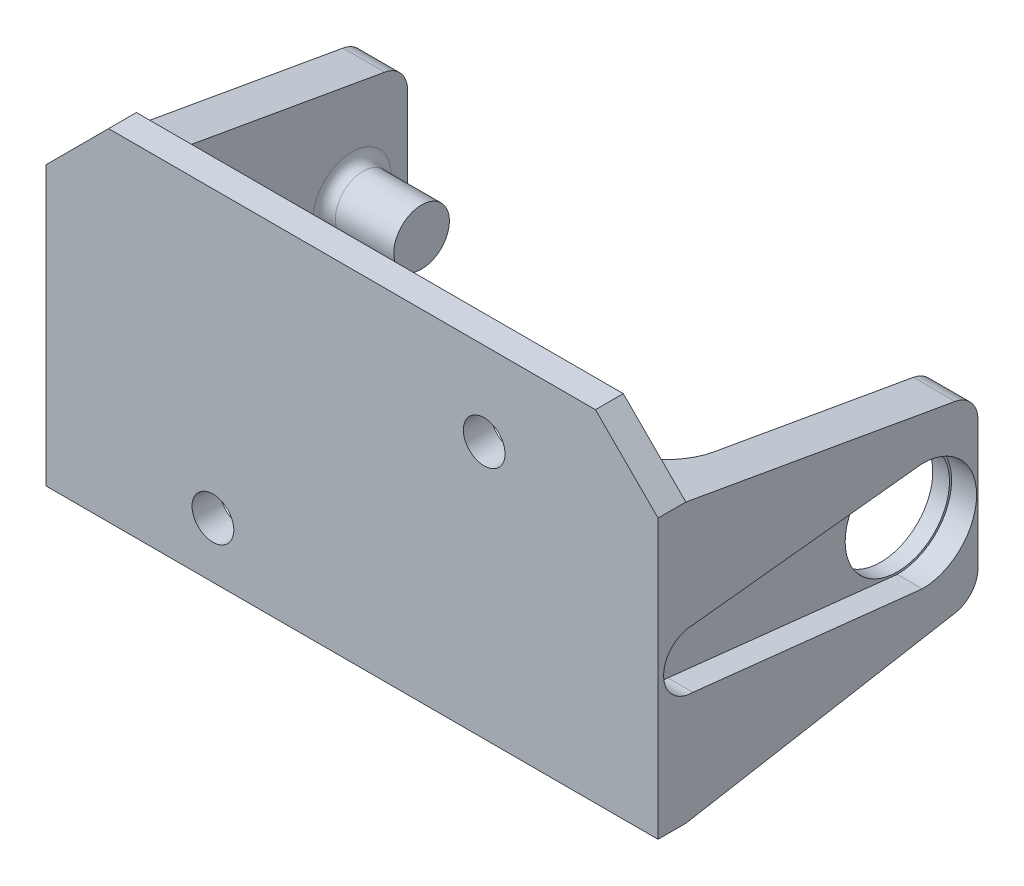
ISO-10303-21;
HEADER;
FILE_DESCRIPTION(('STEP AP214'),'2;1');
FILE_NAME('part.step','',(''),(''),'','','');
FILE_SCHEMA(('AUTOMOTIVE_DESIGN { 1 0 10303 214 1 1 1 1 }'));
ENDSEC;
DATA;
#1=APPLICATION_CONTEXT('core data for automotive mechanical design processes');
#2=APPLICATION_PROTOCOL_DEFINITION('international standard','automotive_design',2000,#1);
#3=PRODUCT_CONTEXT('',#1,'mechanical');
#4=PRODUCT('Part','Part','',(#3));
#5=PRODUCT_RELATED_PRODUCT_CATEGORY('part','',(#4));
#6=PRODUCT_DEFINITION_FORMATION('','',#4);
#7=PRODUCT_DEFINITION_CONTEXT('part definition',#1,'design');
#8=PRODUCT_DEFINITION('design','',#6,#7);
#9=PRODUCT_DEFINITION_SHAPE('','',#8);
#10=(LENGTH_UNIT() NAMED_UNIT(*) SI_UNIT(.MILLI.,.METRE.));
#11=(NAMED_UNIT(*) PLANE_ANGLE_UNIT() SI_UNIT($,.RADIAN.));
#12=(NAMED_UNIT(*) SI_UNIT($,.STERADIAN.) SOLID_ANGLE_UNIT());
#13=UNCERTAINTY_MEASURE_WITH_UNIT(LENGTH_MEASURE(1.E-05),#10,'distance_accuracy_value','');
#14=(GEOMETRIC_REPRESENTATION_CONTEXT(3) GLOBAL_UNCERTAINTY_ASSIGNED_CONTEXT((#13)) GLOBAL_UNIT_ASSIGNED_CONTEXT((#10,
#11,#12)) REPRESENTATION_CONTEXT('',''));
#15=CARTESIAN_POINT('',(0.,0.,0.));
#16=DIRECTION('',(0.,0.,1.));
#17=DIRECTION('',(1.,0.,0.));
#18=AXIS2_PLACEMENT_3D('',#15,#16,#17);
#19=CARTESIAN_POINT('',(0.,0.,2.));
#20=DIRECTION('',(0.,0.,-1.));
#21=DIRECTION('',(-1.,0.,0.));
#22=AXIS2_PLACEMENT_3D('',#19,#20,#21);
#23=PLANE('',#22);
#24=CARTESIAN_POINT('',(9.50000000000001,8.49999999999995,2.));
#25=DIRECTION('',(0.,0.,-1.));
#26=DIRECTION('',(-1.,0.,0.));
#27=AXIS2_PLACEMENT_3D('',#24,#25,#26);
#28=CIRCLE('',#27,1.5);
#29=CARTESIAN_POINT('',(8.00000000000001,8.49999999999995,2.));
#30=VERTEX_POINT('',#29);
#31=EDGE_CURVE('E547',#30,#30,#28,.T.);
#32=ORIENTED_EDGE('',*,*,#31,.T.);
#33=EDGE_LOOP('',(#32));
#34=FACE_BOUND('',#33,.T.);
#35=CARTESIAN_POINT('',(-10.,-6.,2.));
#36=DIRECTION('',(0.,0.,-1.));
#37=DIRECTION('',(-1.,0.,0.));
#38=AXIS2_PLACEMENT_3D('',#35,#36,#37);
#39=CIRCLE('',#38,1.5);
#40=CARTESIAN_POINT('',(-11.5,-6.,2.));
#41=VERTEX_POINT('',#40);
#42=EDGE_CURVE('E548',#41,#41,#39,.T.);
#43=ORIENTED_EDGE('',*,*,#42,.T.);
#44=EDGE_LOOP('',(#43));
#45=FACE_BOUND('',#44,.T.);
#46=DIRECTION('',(0.,-1.,0.));
#47=VECTOR('',#46,1.);
#48=CARTESIAN_POINT('',(-22.,-10.,2.));
#49=LINE('',#48,#47);
#50=CARTESIAN_POINT('',(-22.,10.,2.));
#51=VERTEX_POINT('',#50);
#52=CARTESIAN_POINT('',(-22.,-10.,2.));
#53=VERTEX_POINT('',#52);
#54=EDGE_CURVE('E228',#51,#53,#49,.T.);
#55=ORIENTED_EDGE('',*,*,#54,.T.);
#56=DIRECTION('',(1.,0.,0.));
#57=VECTOR('',#56,1.);
#58=CARTESIAN_POINT('',(0.,-10.,2.));
#59=LINE('',#58,#57);
#60=CARTESIAN_POINT('',(22.,-10.,2.));
#61=VERTEX_POINT('',#60);
#62=EDGE_CURVE('E213',#53,#61,#59,.T.);
#63=ORIENTED_EDGE('',*,*,#62,.T.);
#64=DIRECTION('',(0.,-1.,0.));
#65=VECTOR('',#64,1.);
#66=CARTESIAN_POINT('',(22.,-10.,2.));
#67=LINE('',#66,#65);
#68=CARTESIAN_POINT('',(22.,10.,2.));
#69=VERTEX_POINT('',#68);
#70=EDGE_CURVE('E221',#69,#61,#67,.T.);
#71=ORIENTED_EDGE('',*,*,#70,.F.);
#72=DIRECTION('',(0.707106781186551,-0.707106781186544,0.));
#73=VECTOR('',#72,1.);
#74=CARTESIAN_POINT('',(17.5,14.5,2.));
#75=LINE('',#74,#73);
#76=CARTESIAN_POINT('',(17.5,14.5,2.));
#77=VERTEX_POINT('',#76);
#78=EDGE_CURVE('E327',#77,#69,#75,.T.);
#79=ORIENTED_EDGE('',*,*,#78,.F.);
#80=DIRECTION('',(1.,0.,0.));
#81=VECTOR('',#80,1.);
#82=CARTESIAN_POINT('',(-17.5,14.5,2.));
#83=LINE('',#82,#81);
#84=CARTESIAN_POINT('',(-17.5,14.5,2.));
#85=VERTEX_POINT('',#84);
#86=EDGE_CURVE('E321',#85,#77,#83,.T.);
#87=ORIENTED_EDGE('',*,*,#86,.F.);
#88=DIRECTION('',(0.707106781186551,0.707106781186544,0.));
#89=VECTOR('',#88,1.);
#90=CARTESIAN_POINT('',(-22.,10.,2.));
#91=LINE('',#90,#89);
#92=EDGE_CURVE('E336',#51,#85,#91,.T.);
#93=ORIENTED_EDGE('',*,*,#92,.F.);
#94=EDGE_LOOP('',(#55,#63,#71,#79,#87,#93));
#95=FACE_BOUND('',#94,.T.);
#96=ADVANCED_FACE('F68',(#34,#45,#95),#23,.F.);
#97=CARTESIAN_POINT('',(0.,0.,0.));
#98=DIRECTION('',(0.,0.,-1.));
#99=DIRECTION('',(-1.,0.,0.));
#100=AXIS2_PLACEMENT_3D('',#97,#98,#99);
#101=PLANE('',#100);
#102=CARTESIAN_POINT('',(9.50000000000001,8.49999999999995,0.));
#103=DIRECTION('',(0.,0.,-1.));
#104=DIRECTION('',(-1.,0.,0.));
#105=AXIS2_PLACEMENT_3D('',#102,#103,#104);
#106=CIRCLE('',#105,1.5);
#107=CARTESIAN_POINT('',(8.00000000000001,8.49999999999995,0.));
#108=VERTEX_POINT('',#107);
#109=EDGE_CURVE('E545',#108,#108,#106,.T.);
#110=ORIENTED_EDGE('',*,*,#109,.F.);
#111=EDGE_LOOP('',(#110));
#112=FACE_BOUND('',#111,.T.);
#113=CARTESIAN_POINT('',(-10.,-6.,0.));
#114=DIRECTION('',(0.,0.,-1.));
#115=DIRECTION('',(-1.,0.,0.));
#116=AXIS2_PLACEMENT_3D('',#113,#114,#115);
#117=CIRCLE('',#116,1.5);
#118=CARTESIAN_POINT('',(-11.5,-6.,0.));
#119=VERTEX_POINT('',#118);
#120=EDGE_CURVE('E554',#119,#119,#117,.T.);
#121=ORIENTED_EDGE('',*,*,#120,.F.);
#122=EDGE_LOOP('',(#121));
#123=FACE_BOUND('',#122,.T.);
#124=DIRECTION('',(1.,0.,0.));
#125=VECTOR('',#124,1.);
#126=CARTESIAN_POINT('',(0.,-10.,0.));
#127=LINE('',#126,#125);
#128=CARTESIAN_POINT('',(-14.,-10.,0.));
#129=VERTEX_POINT('',#128);
#130=CARTESIAN_POINT('',(14.,-10.,0.));
#131=VERTEX_POINT('',#130);
#132=EDGE_CURVE('E231',#129,#131,#127,.T.);
#133=ORIENTED_EDGE('',*,*,#132,.F.);
#134=DIRECTION('',(0.,-1.,0.));
#135=VECTOR('',#134,1.);
#136=CARTESIAN_POINT('',(-14.,10.,0.));
#137=LINE('',#136,#135);
#138=CARTESIAN_POINT('',(-14.,10.,0.));
#139=VERTEX_POINT('',#138);
#140=EDGE_CURVE('E564',#129,#139,#137,.F.);
#141=ORIENTED_EDGE('',*,*,#140,.T.);
#142=DIRECTION('',(1.,0.,0.));
#143=VECTOR('',#142,1.);
#144=CARTESIAN_POINT('',(-22.,10.,0.));
#145=LINE('',#144,#143);
#146=CARTESIAN_POINT('',(-22.,10.,0.));
#147=VERTEX_POINT('',#146);
#148=EDGE_CURVE('E377',#147,#139,#145,.T.);
#149=ORIENTED_EDGE('',*,*,#148,.F.);
#150=DIRECTION('',(0.707106781186551,0.707106781186544,0.));
#151=VECTOR('',#150,1.);
#152=CARTESIAN_POINT('',(-22.,10.,0.));
#153=LINE('',#152,#151);
#154=CARTESIAN_POINT('',(-17.5,14.5,0.));
#155=VERTEX_POINT('',#154);
#156=EDGE_CURVE('E326',#147,#155,#153,.T.);
#157=ORIENTED_EDGE('',*,*,#156,.T.);
#158=DIRECTION('',(1.,0.,0.));
#159=VECTOR('',#158,1.);
#160=CARTESIAN_POINT('',(-17.5,14.5,0.));
#161=LINE('',#160,#159);
#162=CARTESIAN_POINT('',(17.5,14.5,0.));
#163=VERTEX_POINT('',#162);
#164=EDGE_CURVE('E323',#155,#163,#161,.T.);
#165=ORIENTED_EDGE('',*,*,#164,.T.);
#166=DIRECTION('',(0.707106781186551,-0.707106781186544,0.));
#167=VECTOR('',#166,1.);
#168=CARTESIAN_POINT('',(17.5,14.5,0.));
#169=LINE('',#168,#167);
#170=CARTESIAN_POINT('',(22.,10.,0.));
#171=VERTEX_POINT('',#170);
#172=EDGE_CURVE('E330',#163,#171,#169,.T.);
#173=ORIENTED_EDGE('',*,*,#172,.T.);
#174=DIRECTION('',(-1.,0.,0.));
#175=VECTOR('',#174,1.);
#176=CARTESIAN_POINT('',(22.,10.,0.));
#177=LINE('',#176,#175);
#178=CARTESIAN_POINT('',(14.,10.,0.));
#179=VERTEX_POINT('',#178);
#180=EDGE_CURVE('E255',#171,#179,#177,.T.);
#181=ORIENTED_EDGE('',*,*,#180,.T.);
#182=DIRECTION('',(0.,1.,0.));
#183=VECTOR('',#182,1.);
#184=CARTESIAN_POINT('',(14.,-10.,0.));
#185=LINE('',#184,#183);
#186=EDGE_CURVE('E287',#179,#131,#185,.F.);
#187=ORIENTED_EDGE('',*,*,#186,.T.);
#188=EDGE_LOOP('',(#133,#141,#149,#157,#165,#173,#181,#187));
#189=FACE_BOUND('',#188,.T.);
#190=ADVANCED_FACE('F433',(#112,#123,#189),#101,.T.);
#191=CARTESIAN_POINT('',(22.,-6.58854964879215,-19.3472963553338));
#192=DIRECTION('',(0.,0.984807753012208,0.173648177666927));
#193=DIRECTION('',(0.,-0.173648177666927,0.984807753012209));
#194=AXIS2_PLACEMENT_3D('',#191,#192,#193);
#195=PLANE('',#194);
#196=DIRECTION('',(-1.,0.,0.));
#197=VECTOR('',#196,1.);
#198=CARTESIAN_POINT('',(22.,-10.,0.));
#199=LINE('',#198,#197);
#200=CARTESIAN_POINT('',(22.,-10.,0.));
#201=VERTEX_POINT('',#200);
#202=EDGE_CURVE('E216',#201,#131,#199,.T.);
#203=ORIENTED_EDGE('',*,*,#202,.T.);
#204=CARTESIAN_POINT('',(14.,-9.11836509645769,-5.));
#205=DIRECTION('',(0.,0.984807753012208,0.173648177666927));
#206=DIRECTION('',(0.,-0.173648177666927,0.984807753012209));
#207=AXIS2_PLACEMENT_3D('',#204,#205,#206);
#208=ELLIPSE('',#207,5.07713305942872,5.);
#209=CARTESIAN_POINT('',(19.,-9.11836509645769,-5.));
#210=VERTEX_POINT('',#209);
#211=EDGE_CURVE('E12',#131,#210,#208,.T.);
#212=ORIENTED_EDGE('',*,*,#211,.T.);
#213=DIRECTION('',(0.,0.173648177666927,-0.984807753012209));
#214=VECTOR('',#213,1.);
#215=CARTESIAN_POINT('',(19.,-6.58854964879215,-19.3472963553338));
#216=LINE('',#215,#214);
#217=CARTESIAN_POINT('',(19.,-6.58854964879215,-19.3472963553338));
#218=VERTEX_POINT('',#217);
#219=EDGE_CURVE('E259',#210,#218,#216,.T.);
#220=ORIENTED_EDGE('',*,*,#219,.T.);
#221=DIRECTION('',(-1.,0.,0.));
#222=VECTOR('',#221,1.);
#223=CARTESIAN_POINT('',(22.,-6.58854964879215,-19.3472963553338));
#224=LINE('',#223,#222);
#225=CARTESIAN_POINT('',(22.,-6.58854964879215,-19.3472963553338));
#226=VERTEX_POINT('',#225);
#227=EDGE_CURVE('E271',#226,#218,#224,.T.);
#228=ORIENTED_EDGE('',*,*,#227,.F.);
#229=DIRECTION('',(0.,0.173648177666927,-0.984807753012209));
#230=VECTOR('',#229,1.);
#231=CARTESIAN_POINT('',(22.,-6.58854964879215,-19.3472963553338));
#232=LINE('',#231,#230);
#233=EDGE_CURVE('E220',#201,#226,#232,.T.);
#234=ORIENTED_EDGE('',*,*,#233,.F.);
#235=EDGE_LOOP('',(#203,#212,#220,#228,#234));
#236=FACE_BOUND('',#235,.T.);
#237=ADVANCED_FACE('F439',(#236),#195,.F.);
#238=CARTESIAN_POINT('',(22.,-4.61893414276774,-19.));
#239=DIRECTION('',(-1.,0.,0.));
#240=DIRECTION('',(0.,0.,1.));
#241=AXIS2_PLACEMENT_3D('',#238,#239,#240);
#242=CYLINDRICAL_SURFACE('',#241,2.);
#243=CARTESIAN_POINT('',(19.,-4.61893414276774,-19.));
#244=DIRECTION('',(1.,0.,0.));
#245=DIRECTION('',(0.,0.,1.));
#246=AXIS2_PLACEMENT_3D('',#243,#244,#245);
#247=CIRCLE('',#246,2.);
#248=CARTESIAN_POINT('',(19.,-4.61893414276774,-21.));
#249=VERTEX_POINT('',#248);
#250=EDGE_CURVE('E256',#218,#249,#247,.T.);
#251=ORIENTED_EDGE('',*,*,#250,.T.);
#252=DIRECTION('',(-1.,0.,0.));
#253=VECTOR('',#252,1.);
#254=CARTESIAN_POINT('',(22.,-4.61893414276774,-21.));
#255=LINE('',#254,#253);
#256=CARTESIAN_POINT('',(22.,-4.61893414276774,-21.));
#257=VERTEX_POINT('',#256);
#258=EDGE_CURVE('E268',#257,#249,#255,.T.);
#259=ORIENTED_EDGE('',*,*,#258,.F.);
#260=CARTESIAN_POINT('',(22.,-4.61893414276774,-19.));
#261=DIRECTION('',(1.,0.,0.));
#262=DIRECTION('',(0.,0.,1.));
#263=AXIS2_PLACEMENT_3D('',#260,#261,#262);
#264=CIRCLE('',#263,2.);
#265=EDGE_CURVE('E246',#226,#257,#264,.T.);
#266=ORIENTED_EDGE('',*,*,#265,.F.);
#267=ORIENTED_EDGE('',*,*,#227,.T.);
#268=EDGE_LOOP('',(#251,#259,#266,#267));
#269=FACE_BOUND('',#268,.T.);
#270=ADVANCED_FACE('F446',(#269),#242,.T.);
#271=CARTESIAN_POINT('',(22.,4.61893414276776,-21.));
#272=DIRECTION('',(0.,0.,1.));
#273=DIRECTION('',(0.,-1.,0.));
#274=AXIS2_PLACEMENT_3D('',#271,#272,#273);
#275=PLANE('',#274);
#276=DIRECTION('',(0.,1.,0.));
#277=VECTOR('',#276,1.);
#278=CARTESIAN_POINT('',(19.,4.61893414276776,-21.));
#279=LINE('',#278,#277);
#280=CARTESIAN_POINT('',(19.,4.61893414276776,-21.));
#281=VERTEX_POINT('',#280);
#282=EDGE_CURVE('E258',#249,#281,#279,.T.);
#283=ORIENTED_EDGE('',*,*,#282,.T.);
#284=DIRECTION('',(-1.,0.,0.));
#285=VECTOR('',#284,1.);
#286=CARTESIAN_POINT('',(22.,4.61893414276776,-21.));
#287=LINE('',#286,#285);
#288=CARTESIAN_POINT('',(22.,4.61893414276776,-21.));
#289=VERTEX_POINT('',#288);
#290=EDGE_CURVE('E265',#289,#281,#287,.T.);
#291=ORIENTED_EDGE('',*,*,#290,.F.);
#292=DIRECTION('',(0.,1.,0.));
#293=VECTOR('',#292,1.);
#294=CARTESIAN_POINT('',(22.,4.61893414276776,-21.));
#295=LINE('',#294,#293);
#296=EDGE_CURVE('E248',#257,#289,#295,.T.);
#297=ORIENTED_EDGE('',*,*,#296,.F.);
#298=ORIENTED_EDGE('',*,*,#258,.T.);
#299=EDGE_LOOP('',(#283,#291,#297,#298));
#300=FACE_BOUND('',#299,.T.);
#301=ADVANCED_FACE('F450',(#300),#275,.F.);
#302=CARTESIAN_POINT('',(22.,4.61893414276776,-19.));
#303=DIRECTION('',(-1.,0.,0.));
#304=DIRECTION('',(0.,0.,1.));
#305=AXIS2_PLACEMENT_3D('',#302,#303,#304);
#306=CYLINDRICAL_SURFACE('',#305,2.);
#307=CARTESIAN_POINT('',(19.,4.61893414276776,-19.));
#308=DIRECTION('',(1.,0.,0.));
#309=DIRECTION('',(0.,0.,1.));
#310=AXIS2_PLACEMENT_3D('',#307,#308,#309);
#311=CIRCLE('',#310,2.);
#312=CARTESIAN_POINT('',(19.,6.58854964879218,-19.3472963553338));
#313=VERTEX_POINT('',#312);
#314=EDGE_CURVE('E239',#281,#313,#311,.T.);
#315=ORIENTED_EDGE('',*,*,#314,.T.);
#316=DIRECTION('',(-1.,0.,0.));
#317=VECTOR('',#316,1.);
#318=CARTESIAN_POINT('',(22.,6.58854964879218,-19.3472963553338));
#319=LINE('',#318,#317);
#320=CARTESIAN_POINT('',(22.,6.58854964879218,-19.3472963553338));
#321=VERTEX_POINT('',#320);
#322=EDGE_CURVE('E262',#321,#313,#319,.T.);
#323=ORIENTED_EDGE('',*,*,#322,.F.);
#324=CARTESIAN_POINT('',(22.,4.61893414276776,-19.));
#325=DIRECTION('',(1.,0.,0.));
#326=DIRECTION('',(0.,0.,1.));
#327=AXIS2_PLACEMENT_3D('',#324,#325,#326);
#328=CIRCLE('',#327,2.);
#329=EDGE_CURVE('E250',#289,#321,#328,.T.);
#330=ORIENTED_EDGE('',*,*,#329,.F.);
#331=ORIENTED_EDGE('',*,*,#290,.T.);
#332=EDGE_LOOP('',(#315,#323,#330,#331));
#333=FACE_BOUND('',#332,.T.);
#334=ADVANCED_FACE('F454',(#333),#306,.T.);
#335=CARTESIAN_POINT('',(22.,10.,0.));
#336=DIRECTION('',(0.,-0.984807753012209,0.173648177666926));
#337=DIRECTION('',(0.,-0.173648177666926,-0.984807753012209));
#338=AXIS2_PLACEMENT_3D('',#335,#336,#337);
#339=PLANE('',#338);
#340=DIRECTION('',(0.,0.173648177666926,0.984807753012209));
#341=VECTOR('',#340,1.);
#342=CARTESIAN_POINT('',(19.,10.,0.));
#343=LINE('',#342,#341);
#344=CARTESIAN_POINT('',(19.,9.1183650964577,-5.));
#345=VERTEX_POINT('',#344);
#346=EDGE_CURVE('E236',#313,#345,#343,.T.);
#347=ORIENTED_EDGE('',*,*,#346,.T.);
#348=CARTESIAN_POINT('',(14.,9.1183650964577,-5.));
#349=DIRECTION('',(0.,-0.984807753012209,0.173648177666926));
#350=DIRECTION('',(0.,-0.173648177666926,-0.984807753012209));
#351=AXIS2_PLACEMENT_3D('',#348,#349,#350);
#352=ELLIPSE('',#351,5.07713305942872,5.);
#353=EDGE_CURVE('E77',#345,#179,#352,.T.);
#354=ORIENTED_EDGE('',*,*,#353,.T.);
#355=ORIENTED_EDGE('',*,*,#180,.F.);
#356=DIRECTION('',(0.,0.173648177666926,0.984807753012209));
#357=VECTOR('',#356,1.);
#358=CARTESIAN_POINT('',(22.,10.,0.));
#359=LINE('',#358,#357);
#360=EDGE_CURVE('E252',#321,#171,#359,.T.);
#361=ORIENTED_EDGE('',*,*,#360,.F.);
#362=ORIENTED_EDGE('',*,*,#322,.T.);
#363=EDGE_LOOP('',(#347,#354,#355,#361,#362));
#364=FACE_BOUND('',#363,.T.);
#365=ADVANCED_FACE('F458',(#364),#339,.F.);
#366=CARTESIAN_POINT('',(22.,4.61893414276776,-19.));
#367=DIRECTION('',(-1.,0.,0.));
#368=DIRECTION('',(0.,0.,1.));
#369=AXIS2_PLACEMENT_3D('',#366,#367,#368);
#370=PLANE('',#369);
#371=CARTESIAN_POINT('',(22.,0.,-0.499999999999997));
#372=DIRECTION('',(-1.,0.,0.));
#373=DIRECTION('',(0.,0.,1.));
#374=AXIS2_PLACEMENT_3D('',#371,#372,#373);
#375=CIRCLE('',#374,2.1);
#376=CARTESIAN_POINT('',(22.,-2.1,-0.499999999999997));
#377=VERTEX_POINT('',#376);
#378=CARTESIAN_POINT('',(22.,2.1,-0.499999999999997));
#379=VERTEX_POINT('',#378);
#380=EDGE_CURVE('E394',#377,#379,#375,.T.);
#381=ORIENTED_EDGE('',*,*,#380,.T.);
#382=DIRECTION('',(0.,0.108447510175418,-0.994102176607995));
#383=VECTOR('',#382,1.);
#384=CARTESIAN_POINT('',(22.,4.12407109739942,-19.0539850594947));
#385=LINE('',#384,#383);
#386=CARTESIAN_POINT('',(22.,3.9,-17.));
#387=VERTEX_POINT('',#386);
#388=EDGE_CURVE('E403',#379,#387,#385,.T.);
#389=ORIENTED_EDGE('',*,*,#388,.T.);
#390=CARTESIAN_POINT('',(22.,0.,-17.));
#391=DIRECTION('',(-1.,0.,0.));
#392=DIRECTION('',(0.,0.,1.));
#393=AXIS2_PLACEMENT_3D('',#390,#391,#392);
#394=CIRCLE('',#393,3.9);
#395=CARTESIAN_POINT('',(22.,-3.9,-17.));
#396=VERTEX_POINT('',#395);
#397=EDGE_CURVE('E400',#387,#396,#394,.T.);
#398=ORIENTED_EDGE('',*,*,#397,.T.);
#399=DIRECTION('',(0.,0.108447510175418,0.994102176607995));
#400=VECTOR('',#399,1.);
#401=CARTESIAN_POINT('',(22.,-4.01542579903965,-18.0580698245301));
#402=LINE('',#401,#400);
#403=EDGE_CURVE('E397',#396,#377,#402,.T.);
#404=ORIENTED_EDGE('',*,*,#403,.T.);
#405=EDGE_LOOP('',(#381,#389,#398,#404));
#406=FACE_BOUND('',#405,.T.);
#407=ORIENTED_EDGE('',*,*,#70,.T.);
#408=DIRECTION('',(0.,0.,-1.));
#409=VECTOR('',#408,1.);
#410=CARTESIAN_POINT('',(22.,-10.,0.));
#411=LINE('',#410,#409);
#412=EDGE_CURVE('E210',#61,#201,#411,.T.);
#413=ORIENTED_EDGE('',*,*,#412,.T.);
#414=ORIENTED_EDGE('',*,*,#233,.T.);
#415=ORIENTED_EDGE('',*,*,#265,.T.);
#416=ORIENTED_EDGE('',*,*,#296,.T.);
#417=ORIENTED_EDGE('',*,*,#329,.T.);
#418=ORIENTED_EDGE('',*,*,#360,.T.);
#419=DIRECTION('',(0.,0.,1.));
#420=VECTOR('',#419,1.);
#421=CARTESIAN_POINT('',(22.,10.,2.));
#422=LINE('',#421,#420);
#423=EDGE_CURVE('E235',#171,#69,#422,.T.);
#424=ORIENTED_EDGE('',*,*,#423,.T.);
#425=EDGE_LOOP('',(#407,#413,#414,#415,#416,#417,#418,#424));
#426=FACE_BOUND('',#425,.T.);
#427=ADVANCED_FACE('F233',(#406,#426),#370,.F.);
#428=CARTESIAN_POINT('',(19.,4.61893414276776,-19.));
#429=DIRECTION('',(-1.,0.,0.));
#430=DIRECTION('',(0.,0.,1.));
#431=AXIS2_PLACEMENT_3D('',#428,#429,#430);
#432=PLANE('',#431);
#433=CARTESIAN_POINT('',(19.,0.,-17.));
#434=DIRECTION('',(-1.,0.,0.));
#435=DIRECTION('',(0.,0.,1.));
#436=AXIS2_PLACEMENT_3D('',#433,#434,#435);
#437=CIRCLE('',#436,3.75);
#438=CARTESIAN_POINT('',(19.,0.,-13.25));
#439=VERTEX_POINT('',#438);
#440=EDGE_CURVE('E230',#439,#439,#437,.T.);
#441=ORIENTED_EDGE('',*,*,#440,.F.);
#442=EDGE_LOOP('',(#441));
#443=FACE_BOUND('',#442,.T.);
#444=ORIENTED_EDGE('',*,*,#219,.F.);
#445=DIRECTION('',(0.,1.,0.));
#446=VECTOR('',#445,1.);
#447=CARTESIAN_POINT('',(19.,10.,-5.));
#448=LINE('',#447,#446);
#449=EDGE_CURVE('E573',#210,#345,#448,.T.);
#450=ORIENTED_EDGE('',*,*,#449,.T.);
#451=ORIENTED_EDGE('',*,*,#346,.F.);
#452=ORIENTED_EDGE('',*,*,#314,.F.);
#453=ORIENTED_EDGE('',*,*,#282,.F.);
#454=ORIENTED_EDGE('',*,*,#250,.F.);
#455=EDGE_LOOP('',(#444,#450,#451,#452,#453,#454));
#456=FACE_BOUND('',#455,.T.);
#457=ADVANCED_FACE('F463',(#443,#456),#432,.T.);
#458=CARTESIAN_POINT('',(-22.,10.,0.));
#459=DIRECTION('',(0.,0.984807753012209,-0.173648177666926));
#460=DIRECTION('',(0.,0.173648177666926,0.984807753012209));
#461=AXIS2_PLACEMENT_3D('',#458,#459,#460);
#462=PLANE('',#461);
#463=DIRECTION('',(0.,0.173648177666926,0.984807753012209));
#464=VECTOR('',#463,1.);
#465=CARTESIAN_POINT('',(-19.,10.,0.));
#466=LINE('',#465,#464);
#467=CARTESIAN_POINT('',(-19.,6.58854964879218,-19.3472963553338));
#468=VERTEX_POINT('',#467);
#469=CARTESIAN_POINT('',(-19.,9.1183650964577,-5.));
#470=VERTEX_POINT('',#469);
#471=EDGE_CURVE('E333',#468,#470,#466,.T.);
#472=ORIENTED_EDGE('',*,*,#471,.F.);
#473=DIRECTION('',(1.,0.,0.));
#474=VECTOR('',#473,1.);
#475=CARTESIAN_POINT('',(-22.,6.58854964879218,-19.3472963553338));
#476=LINE('',#475,#474);
#477=CARTESIAN_POINT('',(-22.,6.58854964879218,-19.3472963553338));
#478=VERTEX_POINT('',#477);
#479=EDGE_CURVE('E242',#478,#468,#476,.T.);
#480=ORIENTED_EDGE('',*,*,#479,.F.);
#481=DIRECTION('',(0.,0.173648177666926,0.984807753012209));
#482=VECTOR('',#481,1.);
#483=CARTESIAN_POINT('',(-22.,10.,0.));
#484=LINE('',#483,#482);
#485=EDGE_CURVE('E344',#478,#147,#484,.T.);
#486=ORIENTED_EDGE('',*,*,#485,.T.);
#487=ORIENTED_EDGE('',*,*,#148,.T.);
#488=CARTESIAN_POINT('',(-14.,9.1183650964577,-5.));
#489=DIRECTION('',(0.,0.984807753012209,-0.173648177666926));
#490=DIRECTION('',(0.,0.173648177666926,0.984807753012209));
#491=AXIS2_PLACEMENT_3D('',#488,#489,#490);
#492=ELLIPSE('',#491,5.07713305942872,5.);
#493=EDGE_CURVE('E572',#139,#470,#492,.F.);
#494=ORIENTED_EDGE('',*,*,#493,.T.);
#495=EDGE_LOOP('',(#472,#480,#486,#487,#494));
#496=FACE_BOUND('',#495,.T.);
#497=ADVANCED_FACE('F466',(#496),#462,.T.);
#498=CARTESIAN_POINT('',(-22.,4.61893414276776,-19.));
#499=DIRECTION('',(1.,0.,0.));
#500=DIRECTION('',(0.,0.,-1.));
#501=AXIS2_PLACEMENT_3D('',#498,#499,#500);
#502=CYLINDRICAL_SURFACE('',#501,2.);
#503=CARTESIAN_POINT('',(-19.,4.61893414276776,-19.));
#504=DIRECTION('',(1.,0.,0.));
#505=DIRECTION('',(0.,0.,1.));
#506=AXIS2_PLACEMENT_3D('',#503,#504,#505);
#507=CIRCLE('',#506,2.);
#508=CARTESIAN_POINT('',(-19.,4.61893414276776,-21.));
#509=VERTEX_POINT('',#508);
#510=EDGE_CURVE('E361',#509,#468,#507,.T.);
#511=ORIENTED_EDGE('',*,*,#510,.F.);
#512=DIRECTION('',(1.,0.,0.));
#513=VECTOR('',#512,1.);
#514=CARTESIAN_POINT('',(-22.,4.61893414276776,-21.));
#515=LINE('',#514,#513);
#516=CARTESIAN_POINT('',(-22.,4.61893414276776,-21.));
#517=VERTEX_POINT('',#516);
#518=EDGE_CURVE('E373',#517,#509,#515,.T.);
#519=ORIENTED_EDGE('',*,*,#518,.F.);
#520=CARTESIAN_POINT('',(-22.,4.61893414276776,-19.));
#521=DIRECTION('',(1.,0.,0.));
#522=DIRECTION('',(0.,0.,1.));
#523=AXIS2_PLACEMENT_3D('',#520,#521,#522);
#524=CIRCLE('',#523,2.);
#525=EDGE_CURVE('E347',#517,#478,#524,.T.);
#526=ORIENTED_EDGE('',*,*,#525,.T.);
#527=ORIENTED_EDGE('',*,*,#479,.T.);
#528=EDGE_LOOP('',(#511,#519,#526,#527));
#529=FACE_BOUND('',#528,.T.);
#530=ADVANCED_FACE('F473',(#529),#502,.T.);
#531=CARTESIAN_POINT('',(-22.,4.61893414276776,-21.));
#532=DIRECTION('',(0.,0.,-1.));
#533=DIRECTION('',(0.,1.,0.));
#534=AXIS2_PLACEMENT_3D('',#531,#532,#533);
#535=PLANE('',#534);
#536=DIRECTION('',(0.,1.,0.));
#537=VECTOR('',#536,1.);
#538=CARTESIAN_POINT('',(-19.,4.61893414276776,-21.));
#539=LINE('',#538,#537);
#540=CARTESIAN_POINT('',(-19.,-4.61893414276774,-21.));
#541=VERTEX_POINT('',#540);
#542=EDGE_CURVE('E364',#541,#509,#539,.T.);
#543=ORIENTED_EDGE('',*,*,#542,.F.);
#544=DIRECTION('',(1.,0.,0.));
#545=VECTOR('',#544,1.);
#546=CARTESIAN_POINT('',(-22.,-4.61893414276774,-21.));
#547=LINE('',#546,#545);
#548=CARTESIAN_POINT('',(-22.,-4.61893414276774,-21.));
#549=VERTEX_POINT('',#548);
#550=EDGE_CURVE('E372',#549,#541,#547,.T.);
#551=ORIENTED_EDGE('',*,*,#550,.F.);
#552=DIRECTION('',(0.,1.,0.));
#553=VECTOR('',#552,1.);
#554=CARTESIAN_POINT('',(-22.,4.61893414276776,-21.));
#555=LINE('',#554,#553);
#556=EDGE_CURVE('E350',#549,#517,#555,.T.);
#557=ORIENTED_EDGE('',*,*,#556,.T.);
#558=ORIENTED_EDGE('',*,*,#518,.T.);
#559=EDGE_LOOP('',(#543,#551,#557,#558));
#560=FACE_BOUND('',#559,.T.);
#561=ADVANCED_FACE('F476',(#560),#535,.T.);
#562=CARTESIAN_POINT('',(-22.,-4.61893414276774,-19.));
#563=DIRECTION('',(1.,0.,0.));
#564=DIRECTION('',(0.,0.,-1.));
#565=AXIS2_PLACEMENT_3D('',#562,#563,#564);
#566=CYLINDRICAL_SURFACE('',#565,2.);
#567=CARTESIAN_POINT('',(-19.,-4.61893414276774,-19.));
#568=DIRECTION('',(1.,0.,0.));
#569=DIRECTION('',(0.,0.,1.));
#570=AXIS2_PLACEMENT_3D('',#567,#568,#569);
#571=CIRCLE('',#570,2.);
#572=CARTESIAN_POINT('',(-19.,-6.58854964879215,-19.3472963553338));
#573=VERTEX_POINT('',#572);
#574=EDGE_CURVE('E281',#573,#541,#571,.T.);
#575=ORIENTED_EDGE('',*,*,#574,.F.);
#576=DIRECTION('',(1.,0.,0.));
#577=VECTOR('',#576,1.);
#578=CARTESIAN_POINT('',(-22.,-6.58854964879215,-19.3472963553338));
#579=LINE('',#578,#577);
#580=CARTESIAN_POINT('',(-22.,-6.58854964879215,-19.3472963553338));
#581=VERTEX_POINT('',#580);
#582=EDGE_CURVE('E369',#581,#573,#579,.T.);
#583=ORIENTED_EDGE('',*,*,#582,.F.);
#584=CARTESIAN_POINT('',(-22.,-4.61893414276774,-19.));
#585=DIRECTION('',(1.,0.,0.));
#586=DIRECTION('',(0.,0.,1.));
#587=AXIS2_PLACEMENT_3D('',#584,#585,#586);
#588=CIRCLE('',#587,2.);
#589=EDGE_CURVE('E353',#581,#549,#588,.T.);
#590=ORIENTED_EDGE('',*,*,#589,.T.);
#591=ORIENTED_EDGE('',*,*,#550,.T.);
#592=EDGE_LOOP('',(#575,#583,#590,#591));
#593=FACE_BOUND('',#592,.T.);
#594=ADVANCED_FACE('F479',(#593),#566,.T.);
#595=CARTESIAN_POINT('',(-22.,-6.58854964879215,-19.3472963553338));
#596=DIRECTION('',(0.,-0.984807753012208,-0.173648177666927));
#597=DIRECTION('',(0.,0.173648177666927,-0.984807753012209));
#598=AXIS2_PLACEMENT_3D('',#595,#596,#597);
#599=PLANE('',#598);
#600=DIRECTION('',(0.,0.173648177666927,-0.984807753012209));
#601=VECTOR('',#600,1.);
#602=CARTESIAN_POINT('',(-19.,-6.58854964879215,-19.3472963553338));
#603=LINE('',#602,#601);
#604=CARTESIAN_POINT('',(-19.,-9.11836509645769,-5.));
#605=VERTEX_POINT('',#604);
#606=EDGE_CURVE('E278',#605,#573,#603,.T.);
#607=ORIENTED_EDGE('',*,*,#606,.F.);
#608=CARTESIAN_POINT('',(-14.,-9.11836509645769,-5.));
#609=DIRECTION('',(0.,-0.984807753012208,-0.173648177666927));
#610=DIRECTION('',(0.,0.173648177666927,-0.984807753012209));
#611=AXIS2_PLACEMENT_3D('',#608,#609,#610);
#612=ELLIPSE('',#611,5.07713305942872,5.);
#613=EDGE_CURVE('E569',#605,#129,#612,.F.);
#614=ORIENTED_EDGE('',*,*,#613,.T.);
#615=DIRECTION('',(1.,0.,0.));
#616=VECTOR('',#615,1.);
#617=CARTESIAN_POINT('',(-22.,-10.,0.));
#618=LINE('',#617,#616);
#619=CARTESIAN_POINT('',(-22.,-10.,0.));
#620=VERTEX_POINT('',#619);
#621=EDGE_CURVE('E84',#620,#129,#618,.T.);
#622=ORIENTED_EDGE('',*,*,#621,.F.);
#623=DIRECTION('',(0.,0.173648177666927,-0.984807753012209));
#624=VECTOR('',#623,1.);
#625=CARTESIAN_POINT('',(-22.,-6.58854964879215,-19.3472963553338));
#626=LINE('',#625,#624);
#627=EDGE_CURVE('E356',#620,#581,#626,.T.);
#628=ORIENTED_EDGE('',*,*,#627,.T.);
#629=ORIENTED_EDGE('',*,*,#582,.T.);
#630=EDGE_LOOP('',(#607,#614,#622,#628,#629));
#631=FACE_BOUND('',#630,.T.);
#632=ADVANCED_FACE('F482',(#631),#599,.T.);
#633=CARTESIAN_POINT('',(-22.,4.61893414276776,-19.));
#634=DIRECTION('',(1.,0.,0.));
#635=DIRECTION('',(0.,0.,1.));
#636=AXIS2_PLACEMENT_3D('',#633,#634,#635);
#637=PLANE('',#636);
#638=ORIENTED_EDGE('',*,*,#54,.F.);
#639=DIRECTION('',(0.,0.,1.));
#640=VECTOR('',#639,1.);
#641=CARTESIAN_POINT('',(-22.,10.,2.));
#642=LINE('',#641,#640);
#643=EDGE_CURVE('E341',#147,#51,#642,.T.);
#644=ORIENTED_EDGE('',*,*,#643,.F.);
#645=ORIENTED_EDGE('',*,*,#485,.F.);
#646=ORIENTED_EDGE('',*,*,#525,.F.);
#647=ORIENTED_EDGE('',*,*,#556,.F.);
#648=ORIENTED_EDGE('',*,*,#589,.F.);
#649=ORIENTED_EDGE('',*,*,#627,.F.);
#650=DIRECTION('',(0.,0.,-1.));
#651=VECTOR('',#650,1.);
#652=CARTESIAN_POINT('',(-22.,-10.,0.));
#653=LINE('',#652,#651);
#654=EDGE_CURVE('E359',#53,#620,#653,.T.);
#655=ORIENTED_EDGE('',*,*,#654,.F.);
#656=EDGE_LOOP('',(#638,#644,#645,#646,#647,#648,#649,#655));
#657=FACE_BOUND('',#656,.T.);
#658=ADVANCED_FACE('F486',(#657),#637,.F.);
#659=CARTESIAN_POINT('',(-19.,4.61893414276776,-19.));
#660=DIRECTION('',(1.,0.,0.));
#661=DIRECTION('',(0.,0.,1.));
#662=AXIS2_PLACEMENT_3D('',#659,#660,#661);
#663=PLANE('',#662);
#664=CARTESIAN_POINT('',(-19.,0.,-17.));
#665=DIRECTION('',(1.,0.,0.));
#666=DIRECTION('',(0.,0.,-1.));
#667=AXIS2_PLACEMENT_3D('',#664,#665,#666);
#668=CIRCLE('',#667,2.8);
#669=CARTESIAN_POINT('',(-19.,0.,-19.8));
#670=VERTEX_POINT('',#669);
#671=EDGE_CURVE('E282',#670,#670,#668,.F.);
#672=ORIENTED_EDGE('',*,*,#671,.T.);
#673=EDGE_LOOP('',(#672));
#674=FACE_BOUND('',#673,.T.);
#675=ORIENTED_EDGE('',*,*,#471,.T.);
#676=DIRECTION('',(0.,-1.,0.));
#677=VECTOR('',#676,1.);
#678=CARTESIAN_POINT('',(-19.,-10.,-5.));
#679=LINE('',#678,#677);
#680=EDGE_CURVE('E284',#470,#605,#679,.T.);
#681=ORIENTED_EDGE('',*,*,#680,.T.);
#682=ORIENTED_EDGE('',*,*,#606,.T.);
#683=ORIENTED_EDGE('',*,*,#574,.T.);
#684=ORIENTED_EDGE('',*,*,#542,.T.);
#685=ORIENTED_EDGE('',*,*,#510,.T.);
#686=EDGE_LOOP('',(#675,#681,#682,#683,#684,#685));
#687=FACE_BOUND('',#686,.T.);
#688=ADVANCED_FACE('F414',(#674,#687),#663,.T.);
#689=CARTESIAN_POINT('',(17.5,14.5,2.));
#690=DIRECTION('',(0.707106781186544,0.707106781186551,0.));
#691=DIRECTION('',(-0.707106781186551,0.707106781186544,0.));
#692=AXIS2_PLACEMENT_3D('',#689,#690,#691);
#693=PLANE('',#692);
#694=ORIENTED_EDGE('',*,*,#172,.F.);
#695=DIRECTION('',(0.,0.,-1.));
#696=VECTOR('',#695,1.);
#697=CARTESIAN_POINT('',(17.5,14.5,2.));
#698=LINE('',#697,#696);
#699=EDGE_CURVE('E313',#77,#163,#698,.T.);
#700=ORIENTED_EDGE('',*,*,#699,.F.);
#701=ORIENTED_EDGE('',*,*,#78,.T.);
#702=ORIENTED_EDGE('',*,*,#423,.F.);
#703=EDGE_LOOP('',(#694,#700,#701,#702));
#704=FACE_BOUND('',#703,.T.);
#705=ADVANCED_FACE('F490',(#704),#693,.T.);
#706=CARTESIAN_POINT('',(-17.5,14.5,2.));
#707=DIRECTION('',(0.,1.,0.));
#708=DIRECTION('',(-1.,0.,0.));
#709=AXIS2_PLACEMENT_3D('',#706,#707,#708);
#710=PLANE('',#709);
#711=ORIENTED_EDGE('',*,*,#164,.F.);
#712=DIRECTION('',(0.,0.,-1.));
#713=VECTOR('',#712,1.);
#714=CARTESIAN_POINT('',(-17.5,14.5,2.));
#715=LINE('',#714,#713);
#716=EDGE_CURVE('E319',#85,#155,#715,.T.);
#717=ORIENTED_EDGE('',*,*,#716,.F.);
#718=ORIENTED_EDGE('',*,*,#86,.T.);
#719=ORIENTED_EDGE('',*,*,#699,.T.);
#720=EDGE_LOOP('',(#711,#717,#718,#719));
#721=FACE_BOUND('',#720,.T.);
#722=ADVANCED_FACE('F494',(#721),#710,.T.);
#723=CARTESIAN_POINT('',(-22.,10.,2.));
#724=DIRECTION('',(-0.707106781186544,0.707106781186551,0.));
#725=DIRECTION('',(-0.707106781186551,-0.707106781186544,0.));
#726=AXIS2_PLACEMENT_3D('',#723,#724,#725);
#727=PLANE('',#726);
#728=ORIENTED_EDGE('',*,*,#156,.F.);
#729=ORIENTED_EDGE('',*,*,#643,.T.);
#730=ORIENTED_EDGE('',*,*,#92,.T.);
#731=ORIENTED_EDGE('',*,*,#716,.T.);
#732=EDGE_LOOP('',(#728,#729,#730,#731));
#733=FACE_BOUND('',#732,.T.);
#734=ADVANCED_FACE('F497',(#733),#727,.T.);
#735=CARTESIAN_POINT('',(22.2,2.02139823587063,0.220516171185887));
#736=DIRECTION('',(0.,0.994102176607995,0.108447510175418));
#737=DIRECTION('',(0.,-0.108447510175418,0.994102176607995));
#738=AXIS2_PLACEMENT_3D('',#735,#736,#737);
#739=PLANE('',#738);
#740=DIRECTION('',(-1.,0.,0.));
#741=VECTOR('',#740,1.);
#742=CARTESIAN_POINT('',(22.2,2.1,-0.499999999999997));
#743=LINE('',#742,#741);
#744=CARTESIAN_POINT('',(20.2,2.1,-0.499999999999997));
#745=VERTEX_POINT('',#744);
#746=EDGE_CURVE('E301',#379,#745,#743,.T.);
#747=ORIENTED_EDGE('',*,*,#746,.T.);
#748=DIRECTION('',(0.,0.108447510175418,-0.994102176607995));
#749=VECTOR('',#748,1.);
#750=CARTESIAN_POINT('',(20.2,2.02139823587063,0.220516171185887));
#751=LINE('',#750,#749);
#752=CARTESIAN_POINT('',(20.2,3.9,-17.));
#753=VERTEX_POINT('',#752);
#754=EDGE_CURVE('E303',#745,#753,#751,.T.);
#755=ORIENTED_EDGE('',*,*,#754,.T.);
#756=DIRECTION('',(-1.,0.,0.));
#757=VECTOR('',#756,1.);
#758=CARTESIAN_POINT('',(22.2,3.9,-17.));
#759=LINE('',#758,#757);
#760=EDGE_CURVE('E316',#387,#753,#759,.T.);
#761=ORIENTED_EDGE('',*,*,#760,.F.);
#762=ORIENTED_EDGE('',*,*,#388,.F.);
#763=EDGE_LOOP('',(#747,#755,#761,#762));
#764=FACE_BOUND('',#763,.T.);
#765=ADVANCED_FACE('F501',(#764),#739,.F.);
#766=CARTESIAN_POINT('',(22.2,0.,-17.));
#767=DIRECTION('',(-1.,0.,0.));
#768=DIRECTION('',(0.,0.,1.));
#769=AXIS2_PLACEMENT_3D('',#766,#767,#768);
#770=CYLINDRICAL_SURFACE('',#769,3.9);
#771=ORIENTED_EDGE('',*,*,#760,.T.);
#772=CARTESIAN_POINT('',(20.2,0.,-17.));
#773=DIRECTION('',(-1.,0.,0.));
#774=DIRECTION('',(0.,0.,1.));
#775=AXIS2_PLACEMENT_3D('',#772,#773,#774);
#776=CIRCLE('',#775,3.9);
#777=CARTESIAN_POINT('',(20.2,-3.9,-17.));
#778=VERTEX_POINT('',#777);
#779=EDGE_CURVE('E306',#753,#778,#776,.T.);
#780=ORIENTED_EDGE('',*,*,#779,.T.);
#781=DIRECTION('',(-1.,0.,0.));
#782=VECTOR('',#781,1.);
#783=CARTESIAN_POINT('',(22.2,-3.9,-17.));
#784=LINE('',#783,#782);
#785=EDGE_CURVE('E314',#396,#778,#784,.T.);
#786=ORIENTED_EDGE('',*,*,#785,.F.);
#787=ORIENTED_EDGE('',*,*,#397,.F.);
#788=EDGE_LOOP('',(#771,#780,#786,#787));
#789=FACE_BOUND('',#788,.T.);
#790=ADVANCED_FACE('F508',(#789),#770,.F.);
#791=CARTESIAN_POINT('',(22.2,-2.02139823587063,0.220516171185887));
#792=DIRECTION('',(0.,-0.994102176607995,0.108447510175418));
#793=DIRECTION('',(0.,-0.108447510175418,-0.994102176607995));
#794=AXIS2_PLACEMENT_3D('',#791,#792,#793);
#795=PLANE('',#794);
#796=ORIENTED_EDGE('',*,*,#785,.T.);
#797=DIRECTION('',(0.,0.108447510175418,0.994102176607995));
#798=VECTOR('',#797,1.);
#799=CARTESIAN_POINT('',(20.2,-2.02139823587063,0.220516171185887));
#800=LINE('',#799,#798);
#801=CARTESIAN_POINT('',(20.2,-2.1,-0.499999999999997));
#802=VERTEX_POINT('',#801);
#803=EDGE_CURVE('E302',#778,#802,#800,.T.);
#804=ORIENTED_EDGE('',*,*,#803,.T.);
#805=DIRECTION('',(-1.,0.,0.));
#806=VECTOR('',#805,1.);
#807=CARTESIAN_POINT('',(22.2,-2.1,-0.499999999999997));
#808=LINE('',#807,#806);
#809=EDGE_CURVE('E311',#377,#802,#808,.T.);
#810=ORIENTED_EDGE('',*,*,#809,.F.);
#811=ORIENTED_EDGE('',*,*,#403,.F.);
#812=EDGE_LOOP('',(#796,#804,#810,#811));
#813=FACE_BOUND('',#812,.T.);
#814=ADVANCED_FACE('F512',(#813),#795,.F.);
#815=CARTESIAN_POINT('',(22.2,0.,-0.499999999999997));
#816=DIRECTION('',(-1.,0.,0.));
#817=DIRECTION('',(0.,0.,1.));
#818=AXIS2_PLACEMENT_3D('',#815,#816,#817);
#819=CYLINDRICAL_SURFACE('',#818,2.1);
#820=ORIENTED_EDGE('',*,*,#809,.T.);
#821=CARTESIAN_POINT('',(20.2,0.,-0.499999999999997));
#822=DIRECTION('',(-1.,0.,0.));
#823=DIRECTION('',(0.,0.,1.));
#824=AXIS2_PLACEMENT_3D('',#821,#822,#823);
#825=CIRCLE('',#824,2.1);
#826=EDGE_CURVE('E298',#802,#745,#825,.T.);
#827=ORIENTED_EDGE('',*,*,#826,.T.);
#828=ORIENTED_EDGE('',*,*,#746,.F.);
#829=ORIENTED_EDGE('',*,*,#380,.F.);
#830=EDGE_LOOP('',(#820,#827,#828,#829));
#831=FACE_BOUND('',#830,.T.);
#832=ADVANCED_FACE('F516',(#831),#819,.F.);
#833=CARTESIAN_POINT('',(20.2,0.,0.));
#834=DIRECTION('',(-1.,0.,0.));
#835=DIRECTION('',(0.,0.,1.));
#836=AXIS2_PLACEMENT_3D('',#833,#834,#835);
#837=PLANE('',#836);
#838=CARTESIAN_POINT('',(20.2,0.,-17.));
#839=DIRECTION('',(-1.,0.,0.));
#840=DIRECTION('',(0.,0.,1.));
#841=AXIS2_PLACEMENT_3D('',#838,#839,#840);
#842=CIRCLE('',#841,3.75);
#843=CARTESIAN_POINT('',(20.2,0.,-13.25));
#844=VERTEX_POINT('',#843);
#845=EDGE_CURVE('E297',#844,#844,#842,.T.);
#846=ORIENTED_EDGE('',*,*,#845,.T.);
#847=EDGE_LOOP('',(#846));
#848=FACE_BOUND('',#847,.T.);
#849=ORIENTED_EDGE('',*,*,#826,.F.);
#850=ORIENTED_EDGE('',*,*,#803,.F.);
#851=ORIENTED_EDGE('',*,*,#779,.F.);
#852=ORIENTED_EDGE('',*,*,#754,.F.);
#853=EDGE_LOOP('',(#849,#850,#851,#852));
#854=FACE_BOUND('',#853,.T.);
#855=ADVANCED_FACE('F520',(#848,#854),#837,.F.);
#856=CARTESIAN_POINT('',(21.4,0.,-17.));
#857=DIRECTION('',(-1.,0.,0.));
#858=DIRECTION('',(0.,0.,1.));
#859=AXIS2_PLACEMENT_3D('',#856,#857,#858);
#860=CYLINDRICAL_SURFACE('',#859,3.75);
#861=ORIENTED_EDGE('',*,*,#440,.T.);
#862=EDGE_LOOP('',(#861));
#863=FACE_BOUND('',#862,.T.);
#864=ORIENTED_EDGE('',*,*,#845,.F.);
#865=EDGE_LOOP('',(#864));
#866=FACE_BOUND('',#865,.T.);
#867=ADVANCED_FACE('F524',(#863,#866),#860,.F.);
#868=CARTESIAN_POINT('',(0.,-10.,2.));
#869=DIRECTION('',(0.,1.,0.));
#870=DIRECTION('',(0.,0.,1.));
#871=AXIS2_PLACEMENT_3D('',#868,#869,#870);
#872=PLANE('',#871);
#873=ORIENTED_EDGE('',*,*,#621,.T.);
#874=ORIENTED_EDGE('',*,*,#132,.T.);
#875=ORIENTED_EDGE('',*,*,#202,.F.);
#876=ORIENTED_EDGE('',*,*,#412,.F.);
#877=ORIENTED_EDGE('',*,*,#62,.F.);
#878=ORIENTED_EDGE('',*,*,#654,.T.);
#879=EDGE_LOOP('',(#873,#874,#875,#876,#877,#878));
#880=FACE_BOUND('',#879,.T.);
#881=ADVANCED_FACE('F212',(#880),#872,.F.);
#882=CARTESIAN_POINT('',(-14.,0.,-17.));
#883=DIRECTION('',(-1.,0.,0.));
#884=DIRECTION('',(0.,0.,1.));
#885=AXIS2_PLACEMENT_3D('',#882,#883,#884);
#886=CYLINDRICAL_SURFACE('',#885,2.);
#887=CARTESIAN_POINT('',(-18.2,0.,-17.));
#888=DIRECTION('',(1.,0.,0.));
#889=DIRECTION('',(0.,0.,-1.));
#890=AXIS2_PLACEMENT_3D('',#887,#888,#889);
#891=CIRCLE('',#890,2.);
#892=CARTESIAN_POINT('',(-18.2,0.,-19.));
#893=VERTEX_POINT('',#892);
#894=EDGE_CURVE('E406',#893,#893,#891,.T.);
#895=ORIENTED_EDGE('',*,*,#894,.T.);
#896=EDGE_LOOP('',(#895));
#897=FACE_BOUND('',#896,.T.);
#898=CARTESIAN_POINT('',(-14.,0.,-17.));
#899=DIRECTION('',(-1.,0.,0.));
#900=DIRECTION('',(0.,0.,1.));
#901=AXIS2_PLACEMENT_3D('',#898,#899,#900);
#902=CIRCLE('',#901,2.);
#903=CARTESIAN_POINT('',(-14.,0.,-15.));
#904=VERTEX_POINT('',#903);
#905=EDGE_CURVE('E290',#904,#904,#902,.T.);
#906=ORIENTED_EDGE('',*,*,#905,.T.);
#907=EDGE_LOOP('',(#906));
#908=FACE_BOUND('',#907,.T.);
#909=ADVANCED_FACE('F428',(#897,#908),#886,.T.);
#910=CARTESIAN_POINT('',(-14.,0.,-17.));
#911=DIRECTION('',(-1.,0.,0.));
#912=DIRECTION('',(0.,0.,1.));
#913=AXIS2_PLACEMENT_3D('',#910,#911,#912);
#914=PLANE('',#913);
#915=ORIENTED_EDGE('',*,*,#905,.F.);
#916=EDGE_LOOP('',(#915));
#917=FACE_BOUND('',#916,.T.);
#918=ADVANCED_FACE('F421',(#917),#914,.F.);
#919=CARTESIAN_POINT('',(-18.2,0.,-17.));
#920=DIRECTION('',(1.,0.,0.));
#921=DIRECTION('',(0.,0.,-1.));
#922=AXIS2_PLACEMENT_3D('',#919,#920,#921);
#923=TOROIDAL_SURFACE('',#922,2.8,0.8);
#924=ORIENTED_EDGE('',*,*,#671,.F.);
#925=EDGE_LOOP('',(#924));
#926=FACE_BOUND('',#925,.T.);
#927=ORIENTED_EDGE('',*,*,#894,.F.);
#928=EDGE_LOOP('',(#927));
#929=FACE_BOUND('',#928,.T.);
#930=ADVANCED_FACE('F417',(#926,#929),#923,.F.);
#931=CARTESIAN_POINT('',(-14.,4.61893414276776,-5.));
#932=DIRECTION('',(0.,1.,0.));
#933=DIRECTION('',(0.,0.,1.));
#934=AXIS2_PLACEMENT_3D('',#931,#932,#933);
#935=CYLINDRICAL_SURFACE('',#934,5.);
#936=ORIENTED_EDGE('',*,*,#493,.F.);
#937=ORIENTED_EDGE('',*,*,#140,.F.);
#938=ORIENTED_EDGE('',*,*,#613,.F.);
#939=ORIENTED_EDGE('',*,*,#680,.F.);
#940=EDGE_LOOP('',(#936,#937,#938,#939));
#941=FACE_BOUND('',#940,.T.);
#942=ADVANCED_FACE('F420',(#941),#935,.F.);
#943=CARTESIAN_POINT('',(14.,4.61893414276776,-5.));
#944=DIRECTION('',(0.,-1.,0.));
#945=DIRECTION('',(0.,0.,-1.));
#946=AXIS2_PLACEMENT_3D('',#943,#944,#945);
#947=CYLINDRICAL_SURFACE('',#946,5.);
#948=ORIENTED_EDGE('',*,*,#211,.F.);
#949=ORIENTED_EDGE('',*,*,#186,.F.);
#950=ORIENTED_EDGE('',*,*,#353,.F.);
#951=ORIENTED_EDGE('',*,*,#449,.F.);
#952=EDGE_LOOP('',(#948,#949,#950,#951));
#953=FACE_BOUND('',#952,.T.);
#954=ADVANCED_FACE('F70',(#953),#947,.F.);
#955=CARTESIAN_POINT('',(-10.,-6.,10.));
#956=DIRECTION('',(0.,0.,-1.));
#957=DIRECTION('',(-1.,0.,0.));
#958=AXIS2_PLACEMENT_3D('',#955,#956,#957);
#959=CYLINDRICAL_SURFACE('',#958,1.5);
#960=ORIENTED_EDGE('',*,*,#120,.T.);
#961=EDGE_LOOP('',(#960));
#962=FACE_BOUND('',#961,.T.);
#963=ORIENTED_EDGE('',*,*,#42,.F.);
#964=EDGE_LOOP('',(#963));
#965=FACE_BOUND('',#964,.T.);
#966=ADVANCED_FACE('F533',(#962,#965),#959,.F.);
#967=CARTESIAN_POINT('',(9.50000000000001,8.49999999999995,10.));
#968=DIRECTION('',(0.,0.,-1.));
#969=DIRECTION('',(-1.,0.,0.));
#970=AXIS2_PLACEMENT_3D('',#967,#968,#969);
#971=CYLINDRICAL_SURFACE('',#970,1.5);
#972=ORIENTED_EDGE('',*,*,#109,.T.);
#973=EDGE_LOOP('',(#972));
#974=FACE_BOUND('',#973,.T.);
#975=ORIENTED_EDGE('',*,*,#31,.F.);
#976=EDGE_LOOP('',(#975));
#977=FACE_BOUND('',#976,.T.);
#978=ADVANCED_FACE('F536',(#974,#977),#971,.F.);
#979=CLOSED_SHELL('',(#96,#190,#237,#270,#301,#334,#365,#427,#457,#497,#530,#561,#594,#632,#658,
#688,#705,#722,#734,#765,#790,#814,#832,#855,#867,#881,#909,#918,#930,#942,#954,#966,#978));
#980=MANIFOLD_SOLID_BREP('B2',#979);
#981=ADVANCED_BREP_SHAPE_REPRESENTATION('',(#18,#980),#14);
#982=SHAPE_DEFINITION_REPRESENTATION(#9,#981);
ENDSEC;
END-ISO-10303-21;
